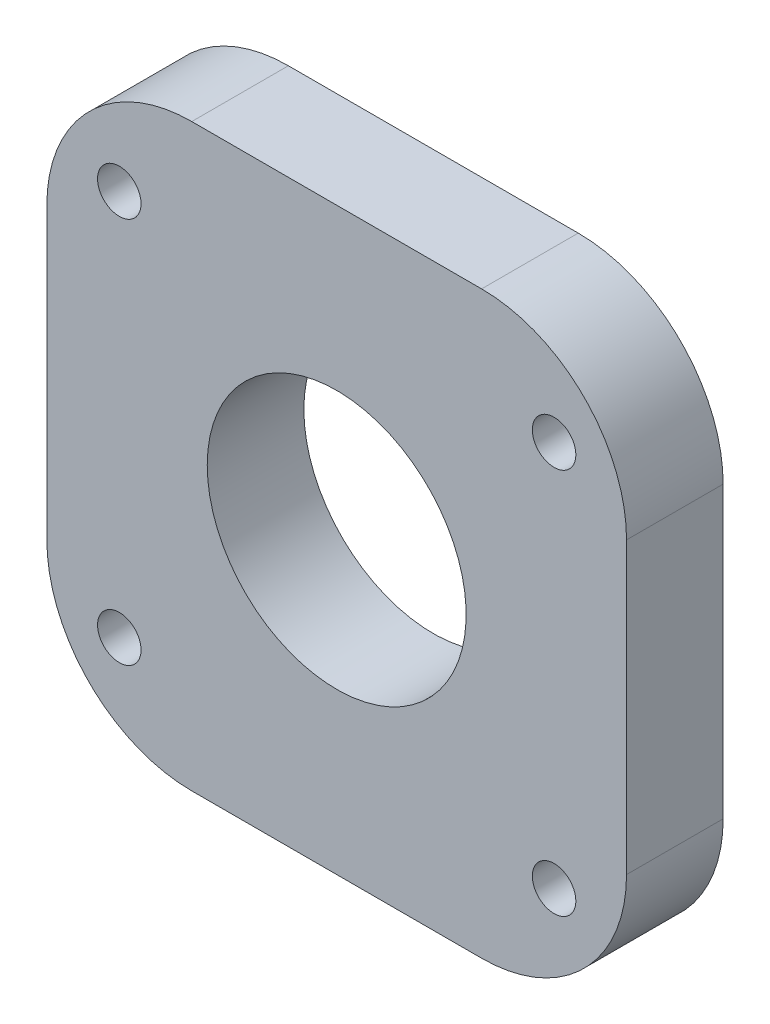
ISO-10303-21;
HEADER;
FILE_DESCRIPTION(('STEP AP214'),'2;1');
FILE_NAME('part.step','',(''),(''),'','','');
FILE_SCHEMA(('AUTOMOTIVE_DESIGN { 1 0 10303 214 1 1 1 1 }'));
ENDSEC;
DATA;
#1=APPLICATION_CONTEXT('core data for automotive mechanical design processes');
#2=APPLICATION_PROTOCOL_DEFINITION('international standard','automotive_design',2000,#1);
#3=PRODUCT_CONTEXT('',#1,'mechanical');
#4=PRODUCT('Part','Part','',(#3));
#5=PRODUCT_RELATED_PRODUCT_CATEGORY('part','',(#4));
#6=PRODUCT_DEFINITION_FORMATION('','',#4);
#7=PRODUCT_DEFINITION_CONTEXT('part definition',#1,'design');
#8=PRODUCT_DEFINITION('design','',#6,#7);
#9=PRODUCT_DEFINITION_SHAPE('','',#8);
#10=(LENGTH_UNIT() NAMED_UNIT(*) SI_UNIT(.MILLI.,.METRE.));
#11=(NAMED_UNIT(*) PLANE_ANGLE_UNIT() SI_UNIT($,.RADIAN.));
#12=(NAMED_UNIT(*) SI_UNIT($,.STERADIAN.) SOLID_ANGLE_UNIT());
#13=UNCERTAINTY_MEASURE_WITH_UNIT(LENGTH_MEASURE(1.E-05),#10,'distance_accuracy_value','');
#14=(GEOMETRIC_REPRESENTATION_CONTEXT(3) GLOBAL_UNCERTAINTY_ASSIGNED_CONTEXT((#13)) GLOBAL_UNIT_ASSIGNED_CONTEXT((#10,
#11,#12)) REPRESENTATION_CONTEXT('',''));
#15=CARTESIAN_POINT('',(0.,0.,0.));
#16=DIRECTION('',(0.,0.,1.));
#17=DIRECTION('',(1.,0.,0.));
#18=AXIS2_PLACEMENT_3D('',#15,#16,#17);
#19=CARTESIAN_POINT('',(30.,-30.,10.));
#20=DIRECTION('',(1.,0.,0.));
#21=DIRECTION('',(0.,0.,-1.));
#22=AXIS2_PLACEMENT_3D('',#19,#20,#21);
#23=PLANE('',#22);
#24=DIRECTION('',(0.,-1.,0.));
#25=VECTOR('',#24,1.);
#26=CARTESIAN_POINT('',(30.,-30.,10.));
#27=LINE('',#26,#25);
#28=CARTESIAN_POINT('',(30.,15.,10.));
#29=VERTEX_POINT('',#28);
#30=CARTESIAN_POINT('',(30.,-15.,10.));
#31=VERTEX_POINT('',#30);
#32=EDGE_CURVE('E258',#29,#31,#27,.T.);
#33=ORIENTED_EDGE('',*,*,#32,.T.);
#34=DIRECTION('',(0.,0.,-1.));
#35=VECTOR('',#34,1.);
#36=CARTESIAN_POINT('',(30.,-15.,10.));
#37=LINE('',#36,#35);
#38=CARTESIAN_POINT('',(30.,-15.,0.));
#39=VERTEX_POINT('',#38);
#40=EDGE_CURVE('E282',#31,#39,#37,.T.);
#41=ORIENTED_EDGE('',*,*,#40,.T.);
#42=DIRECTION('',(0.,-1.,0.));
#43=VECTOR('',#42,1.);
#44=CARTESIAN_POINT('',(30.,-30.,0.));
#45=LINE('',#44,#43);
#46=CARTESIAN_POINT('',(30.,15.,0.));
#47=VERTEX_POINT('',#46);
#48=EDGE_CURVE('E257',#47,#39,#45,.T.);
#49=ORIENTED_EDGE('',*,*,#48,.F.);
#50=DIRECTION('',(0.,0.,-1.));
#51=VECTOR('',#50,1.);
#52=CARTESIAN_POINT('',(30.,15.,10.));
#53=LINE('',#52,#51);
#54=EDGE_CURVE('E270',#47,#29,#53,.F.);
#55=ORIENTED_EDGE('',*,*,#54,.T.);
#56=EDGE_LOOP('',(#33,#41,#49,#55));
#57=FACE_BOUND('',#56,.T.);
#58=ADVANCED_FACE('F32',(#57),#23,.T.);
#59=CARTESIAN_POINT('',(-30.,30.,10.));
#60=DIRECTION('',(0.,1.,0.));
#61=DIRECTION('',(-1.,0.,0.));
#62=AXIS2_PLACEMENT_3D('',#59,#60,#61);
#63=PLANE('',#62);
#64=DIRECTION('',(1.,0.,0.));
#65=VECTOR('',#64,1.);
#66=CARTESIAN_POINT('',(-30.,30.,0.));
#67=LINE('',#66,#65);
#68=CARTESIAN_POINT('',(-15.,30.,0.));
#69=VERTEX_POINT('',#68);
#70=CARTESIAN_POINT('',(15.,30.,0.));
#71=VERTEX_POINT('',#70);
#72=EDGE_CURVE('E262',#69,#71,#67,.T.);
#73=ORIENTED_EDGE('',*,*,#72,.F.);
#74=DIRECTION('',(0.,0.,-1.));
#75=VECTOR('',#74,1.);
#76=CARTESIAN_POINT('',(-15.,30.,10.));
#77=LINE('',#76,#75);
#78=CARTESIAN_POINT('',(-15.,30.,10.));
#79=VERTEX_POINT('',#78);
#80=EDGE_CURVE('E11',#69,#79,#77,.F.);
#81=ORIENTED_EDGE('',*,*,#80,.T.);
#82=DIRECTION('',(1.,0.,0.));
#83=VECTOR('',#82,1.);
#84=CARTESIAN_POINT('',(-30.,30.,10.));
#85=LINE('',#84,#83);
#86=CARTESIAN_POINT('',(15.,30.,10.));
#87=VERTEX_POINT('',#86);
#88=EDGE_CURVE('E267',#79,#87,#85,.T.);
#89=ORIENTED_EDGE('',*,*,#88,.T.);
#90=DIRECTION('',(0.,0.,-1.));
#91=VECTOR('',#90,1.);
#92=CARTESIAN_POINT('',(15.,30.,10.));
#93=LINE('',#92,#91);
#94=EDGE_CURVE('E40',#87,#71,#93,.T.);
#95=ORIENTED_EDGE('',*,*,#94,.T.);
#96=EDGE_LOOP('',(#73,#81,#89,#95));
#97=FACE_BOUND('',#96,.T.);
#98=ADVANCED_FACE('F312',(#97),#63,.T.);
#99=CARTESIAN_POINT('',(-30.,-30.,10.));
#100=DIRECTION('',(-1.,0.,0.));
#101=DIRECTION('',(0.,0.,1.));
#102=AXIS2_PLACEMENT_3D('',#99,#100,#101);
#103=PLANE('',#102);
#104=DIRECTION('',(0.,1.,0.));
#105=VECTOR('',#104,1.);
#106=CARTESIAN_POINT('',(-30.,-30.,0.));
#107=LINE('',#106,#105);
#108=CARTESIAN_POINT('',(-30.,-15.,0.));
#109=VERTEX_POINT('',#108);
#110=CARTESIAN_POINT('',(-30.,15.,0.));
#111=VERTEX_POINT('',#110);
#112=EDGE_CURVE('E276',#109,#111,#107,.T.);
#113=ORIENTED_EDGE('',*,*,#112,.F.);
#114=DIRECTION('',(0.,0.,-1.));
#115=VECTOR('',#114,1.);
#116=CARTESIAN_POINT('',(-30.,-15.,10.));
#117=LINE('',#116,#115);
#118=CARTESIAN_POINT('',(-30.,-15.,10.));
#119=VERTEX_POINT('',#118);
#120=EDGE_CURVE('E54',#109,#119,#117,.F.);
#121=ORIENTED_EDGE('',*,*,#120,.T.);
#122=DIRECTION('',(0.,1.,0.));
#123=VECTOR('',#122,1.);
#124=CARTESIAN_POINT('',(-30.,-30.,10.));
#125=LINE('',#124,#123);
#126=CARTESIAN_POINT('',(-30.,15.,10.));
#127=VERTEX_POINT('',#126);
#128=EDGE_CURVE('E265',#119,#127,#125,.T.);
#129=ORIENTED_EDGE('',*,*,#128,.T.);
#130=DIRECTION('',(0.,0.,-1.));
#131=VECTOR('',#130,1.);
#132=CARTESIAN_POINT('',(-30.,15.,10.));
#133=LINE('',#132,#131);
#134=EDGE_CURVE('E305',#127,#111,#133,.T.);
#135=ORIENTED_EDGE('',*,*,#134,.T.);
#136=EDGE_LOOP('',(#113,#121,#129,#135));
#137=FACE_BOUND('',#136,.T.);
#138=ADVANCED_FACE('F322',(#137),#103,.T.);
#139=CARTESIAN_POINT('',(-30.,-30.,10.));
#140=DIRECTION('',(0.,-1.,0.));
#141=DIRECTION('',(1.,0.,0.));
#142=AXIS2_PLACEMENT_3D('',#139,#140,#141);
#143=PLANE('',#142);
#144=DIRECTION('',(-1.,0.,0.));
#145=VECTOR('',#144,1.);
#146=CARTESIAN_POINT('',(-30.,-30.,0.));
#147=LINE('',#146,#145);
#148=CARTESIAN_POINT('',(15.,-30.,0.));
#149=VERTEX_POINT('',#148);
#150=CARTESIAN_POINT('',(-15.,-30.,0.));
#151=VERTEX_POINT('',#150);
#152=EDGE_CURVE('E273',#149,#151,#147,.T.);
#153=ORIENTED_EDGE('',*,*,#152,.F.);
#154=DIRECTION('',(0.,0.,-1.));
#155=VECTOR('',#154,1.);
#156=CARTESIAN_POINT('',(15.,-30.,10.));
#157=LINE('',#156,#155);
#158=CARTESIAN_POINT('',(15.,-30.,10.));
#159=VERTEX_POINT('',#158);
#160=EDGE_CURVE('E296',#149,#159,#157,.F.);
#161=ORIENTED_EDGE('',*,*,#160,.T.);
#162=DIRECTION('',(-1.,0.,0.));
#163=VECTOR('',#162,1.);
#164=CARTESIAN_POINT('',(-30.,-30.,10.));
#165=LINE('',#164,#163);
#166=CARTESIAN_POINT('',(-15.,-30.,10.));
#167=VERTEX_POINT('',#166);
#168=EDGE_CURVE('E261',#159,#167,#165,.T.);
#169=ORIENTED_EDGE('',*,*,#168,.T.);
#170=DIRECTION('',(0.,0.,-1.));
#171=VECTOR('',#170,1.);
#172=CARTESIAN_POINT('',(-15.,-30.,10.));
#173=LINE('',#172,#171);
#174=EDGE_CURVE('E293',#167,#151,#173,.T.);
#175=ORIENTED_EDGE('',*,*,#174,.T.);
#176=EDGE_LOOP('',(#153,#161,#169,#175));
#177=FACE_BOUND('',#176,.T.);
#178=ADVANCED_FACE('F331',(#177),#143,.T.);
#179=CARTESIAN_POINT('',(0.,0.,10.));
#180=DIRECTION('',(0.,0.,-1.));
#181=DIRECTION('',(-1.,0.,0.));
#182=AXIS2_PLACEMENT_3D('',#179,#180,#181);
#183=PLANE('',#182);
#184=CARTESIAN_POINT('',(0.,0.,10.));
#185=DIRECTION('',(0.,0.,-1.));
#186=DIRECTION('',(-1.,0.,0.));
#187=AXIS2_PLACEMENT_3D('',#184,#185,#186);
#188=CIRCLE('',#187,13.4);
#189=CARTESIAN_POINT('',(-13.4,0.,10.));
#190=VERTEX_POINT('',#189);
#191=EDGE_CURVE('E155',#190,#190,#188,.T.);
#192=ORIENTED_EDGE('',*,*,#191,.T.);
#193=EDGE_LOOP('',(#192));
#194=FACE_BOUND('',#193,.T.);
#195=CARTESIAN_POINT('',(-22.5,20.,10.));
#196=DIRECTION('',(0.,0.,-1.));
#197=DIRECTION('',(-1.,0.,0.));
#198=AXIS2_PLACEMENT_3D('',#195,#196,#197);
#199=CIRCLE('',#198,2.25);
#200=CARTESIAN_POINT('',(-24.75,20.,10.));
#201=VERTEX_POINT('',#200);
#202=EDGE_CURVE('E236',#201,#201,#199,.T.);
#203=ORIENTED_EDGE('',*,*,#202,.T.);
#204=EDGE_LOOP('',(#203));
#205=FACE_BOUND('',#204,.T.);
#206=CARTESIAN_POINT('',(22.5,20.,10.));
#207=DIRECTION('',(0.,0.,-1.));
#208=DIRECTION('',(-1.,0.,0.));
#209=AXIS2_PLACEMENT_3D('',#206,#207,#208);
#210=CIRCLE('',#209,2.25);
#211=CARTESIAN_POINT('',(20.25,20.,10.));
#212=VERTEX_POINT('',#211);
#213=EDGE_CURVE('E242',#212,#212,#210,.T.);
#214=ORIENTED_EDGE('',*,*,#213,.T.);
#215=EDGE_LOOP('',(#214));
#216=FACE_BOUND('',#215,.T.);
#217=CARTESIAN_POINT('',(22.5,-20.,10.));
#218=DIRECTION('',(0.,0.,-1.));
#219=DIRECTION('',(-1.,0.,0.));
#220=AXIS2_PLACEMENT_3D('',#217,#218,#219);
#221=CIRCLE('',#220,2.25);
#222=CARTESIAN_POINT('',(20.25,-20.,10.));
#223=VERTEX_POINT('',#222);
#224=EDGE_CURVE('E248',#223,#223,#221,.T.);
#225=ORIENTED_EDGE('',*,*,#224,.T.);
#226=EDGE_LOOP('',(#225));
#227=FACE_BOUND('',#226,.T.);
#228=CARTESIAN_POINT('',(-22.5,-20.,10.));
#229=DIRECTION('',(0.,0.,-1.));
#230=DIRECTION('',(-1.,0.,0.));
#231=AXIS2_PLACEMENT_3D('',#228,#229,#230);
#232=CIRCLE('',#231,2.25);
#233=CARTESIAN_POINT('',(-24.75,-20.,10.));
#234=VERTEX_POINT('',#233);
#235=EDGE_CURVE('E254',#234,#234,#232,.T.);
#236=ORIENTED_EDGE('',*,*,#235,.T.);
#237=EDGE_LOOP('',(#236));
#238=FACE_BOUND('',#237,.T.);
#239=ORIENTED_EDGE('',*,*,#168,.F.);
#240=CARTESIAN_POINT('',(15.,-15.,10.));
#241=DIRECTION('',(0.,0.,-1.));
#242=DIRECTION('',(-1.,0.,0.));
#243=AXIS2_PLACEMENT_3D('',#240,#241,#242);
#244=CIRCLE('',#243,15.);
#245=EDGE_CURVE('E303',#159,#31,#244,.F.);
#246=ORIENTED_EDGE('',*,*,#245,.T.);
#247=ORIENTED_EDGE('',*,*,#32,.F.);
#248=CARTESIAN_POINT('',(15.,15.,10.));
#249=DIRECTION('',(0.,0.,-1.));
#250=DIRECTION('',(-1.,0.,0.));
#251=AXIS2_PLACEMENT_3D('',#248,#249,#250);
#252=CIRCLE('',#251,15.);
#253=EDGE_CURVE('E298',#29,#87,#252,.F.);
#254=ORIENTED_EDGE('',*,*,#253,.T.);
#255=ORIENTED_EDGE('',*,*,#88,.F.);
#256=CARTESIAN_POINT('',(-15.,15.,10.));
#257=DIRECTION('',(0.,0.,-1.));
#258=DIRECTION('',(-1.,0.,0.));
#259=AXIS2_PLACEMENT_3D('',#256,#257,#258);
#260=CIRCLE('',#259,15.);
#261=EDGE_CURVE('E47',#79,#127,#260,.F.);
#262=ORIENTED_EDGE('',*,*,#261,.T.);
#263=ORIENTED_EDGE('',*,*,#128,.F.);
#264=CARTESIAN_POINT('',(-15.,-15.,10.));
#265=DIRECTION('',(0.,0.,-1.));
#266=DIRECTION('',(-1.,0.,0.));
#267=AXIS2_PLACEMENT_3D('',#264,#265,#266);
#268=CIRCLE('',#267,15.);
#269=EDGE_CURVE('E301',#119,#167,#268,.F.);
#270=ORIENTED_EDGE('',*,*,#269,.T.);
#271=EDGE_LOOP('',(#239,#246,#247,#254,#255,#262,#263,#270));
#272=FACE_BOUND('',#271,.T.);
#273=ADVANCED_FACE('F325',(#194,#205,#216,#227,#238,#272),#183,.F.);
#274=CARTESIAN_POINT('',(0.,0.,0.));
#275=DIRECTION('',(0.,0.,-1.));
#276=DIRECTION('',(-1.,0.,0.));
#277=AXIS2_PLACEMENT_3D('',#274,#275,#276);
#278=PLANE('',#277);
#279=CARTESIAN_POINT('',(0.,0.,0.));
#280=DIRECTION('',(0.,0.,-1.));
#281=DIRECTION('',(-1.,0.,0.));
#282=AXIS2_PLACEMENT_3D('',#279,#280,#281);
#283=CIRCLE('',#282,13.4);
#284=CARTESIAN_POINT('',(-13.4,0.,0.));
#285=VERTEX_POINT('',#284);
#286=EDGE_CURVE('E765',#285,#285,#283,.T.);
#287=ORIENTED_EDGE('',*,*,#286,.F.);
#288=EDGE_LOOP('',(#287));
#289=FACE_BOUND('',#288,.T.);
#290=CARTESIAN_POINT('',(14.0338751103011,11.1916419433643,0.));
#291=DIRECTION('',(0.,0.,-1.));
#292=DIRECTION('',(-1.,0.,0.));
#293=AXIS2_PLACEMENT_3D('',#290,#291,#292);
#294=CIRCLE('',#293,2.54999999999999);
#295=CARTESIAN_POINT('',(11.4838751103011,11.1916419433643,0.));
#296=VERTEX_POINT('',#295);
#297=EDGE_CURVE('E149',#296,#296,#294,.T.);
#298=ORIENTED_EDGE('',*,*,#297,.F.);
#299=EDGE_LOOP('',(#298));
#300=FACE_BOUND('',#299,.T.);
#301=CARTESIAN_POINT('',(7.78821311716017,16.1723911788484,0.));
#302=DIRECTION('',(0.,0.,-1.));
#303=DIRECTION('',(-1.,0.,0.));
#304=AXIS2_PLACEMENT_3D('',#301,#302,#303);
#305=CIRCLE('',#304,2.54999999999999);
#306=CARTESIAN_POINT('',(5.23821311716018,16.1723911788484,0.));
#307=VERTEX_POINT('',#306);
#308=EDGE_CURVE('E148',#307,#307,#305,.T.);
#309=ORIENTED_EDGE('',*,*,#308,.F.);
#310=EDGE_LOOP('',(#309));
#311=FACE_BOUND('',#310,.T.);
#312=CARTESIAN_POINT('',(0.,17.95,0.));
#313=DIRECTION('',(0.,0.,-1.));
#314=DIRECTION('',(-1.,0.,0.));
#315=AXIS2_PLACEMENT_3D('',#312,#313,#314);
#316=CIRCLE('',#315,2.54999999999999);
#317=CARTESIAN_POINT('',(-2.54999999999999,17.95,0.));
#318=VERTEX_POINT('',#317);
#319=EDGE_CURVE('E161',#318,#318,#316,.T.);
#320=ORIENTED_EDGE('',*,*,#319,.F.);
#321=EDGE_LOOP('',(#320));
#322=FACE_BOUND('',#321,.T.);
#323=CARTESIAN_POINT('',(-7.78821311716017,16.1723911788484,0.));
#324=DIRECTION('',(0.,0.,-1.));
#325=DIRECTION('',(-1.,0.,0.));
#326=AXIS2_PLACEMENT_3D('',#323,#324,#325);
#327=CIRCLE('',#326,2.54999999999999);
#328=CARTESIAN_POINT('',(-10.3382131171602,16.1723911788484,0.));
#329=VERTEX_POINT('',#328);
#330=EDGE_CURVE('E167',#329,#329,#327,.T.);
#331=ORIENTED_EDGE('',*,*,#330,.F.);
#332=EDGE_LOOP('',(#331));
#333=FACE_BOUND('',#332,.T.);
#334=CARTESIAN_POINT('',(-14.0338751103011,11.1916419433643,0.));
#335=DIRECTION('',(0.,0.,-1.));
#336=DIRECTION('',(-1.,0.,0.));
#337=AXIS2_PLACEMENT_3D('',#334,#335,#336);
#338=CIRCLE('',#337,2.54999999999999);
#339=CARTESIAN_POINT('',(-16.5838751103011,11.1916419433643,0.));
#340=VERTEX_POINT('',#339);
#341=EDGE_CURVE('E173',#340,#340,#338,.T.);
#342=ORIENTED_EDGE('',*,*,#341,.F.);
#343=EDGE_LOOP('',(#342));
#344=FACE_BOUND('',#343,.T.);
#345=CARTESIAN_POINT('',(-17.4999560236637,3.99425076451585,0.));
#346=DIRECTION('',(0.,0.,-1.));
#347=DIRECTION('',(-1.,0.,0.));
#348=AXIS2_PLACEMENT_3D('',#345,#346,#347);
#349=CIRCLE('',#348,2.54999999999999);
#350=CARTESIAN_POINT('',(-20.0499560236637,3.99425076451585,0.));
#351=VERTEX_POINT('',#350);
#352=EDGE_CURVE('E179',#351,#351,#349,.T.);
#353=ORIENTED_EDGE('',*,*,#352,.F.);
#354=EDGE_LOOP('',(#353));
#355=FACE_BOUND('',#354,.T.);
#356=CARTESIAN_POINT('',(-17.4999560236637,-3.99425076451584,0.));
#357=DIRECTION('',(0.,0.,-1.));
#358=DIRECTION('',(-1.,0.,0.));
#359=AXIS2_PLACEMENT_3D('',#356,#357,#358);
#360=CIRCLE('',#359,2.54999999999999);
#361=CARTESIAN_POINT('',(-20.0499560236637,-3.99425076451584,0.));
#362=VERTEX_POINT('',#361);
#363=EDGE_CURVE('E185',#362,#362,#360,.T.);
#364=ORIENTED_EDGE('',*,*,#363,.F.);
#365=EDGE_LOOP('',(#364));
#366=FACE_BOUND('',#365,.T.);
#367=CARTESIAN_POINT('',(-14.0338751103011,-11.1916419433643,0.));
#368=DIRECTION('',(0.,0.,-1.));
#369=DIRECTION('',(-1.,0.,0.));
#370=AXIS2_PLACEMENT_3D('',#367,#368,#369);
#371=CIRCLE('',#370,2.54999999999999);
#372=CARTESIAN_POINT('',(-16.5838751103011,-11.1916419433643,0.));
#373=VERTEX_POINT('',#372);
#374=EDGE_CURVE('E191',#373,#373,#371,.T.);
#375=ORIENTED_EDGE('',*,*,#374,.F.);
#376=EDGE_LOOP('',(#375));
#377=FACE_BOUND('',#376,.T.);
#378=CARTESIAN_POINT('',(-7.78821311716017,-16.1723911788484,0.));
#379=DIRECTION('',(0.,0.,-1.));
#380=DIRECTION('',(-1.,0.,0.));
#381=AXIS2_PLACEMENT_3D('',#378,#379,#380);
#382=CIRCLE('',#381,2.54999999999999);
#383=CARTESIAN_POINT('',(-10.3382131171602,-16.1723911788484,0.));
#384=VERTEX_POINT('',#383);
#385=EDGE_CURVE('E197',#384,#384,#382,.T.);
#386=ORIENTED_EDGE('',*,*,#385,.F.);
#387=EDGE_LOOP('',(#386));
#388=FACE_BOUND('',#387,.T.);
#389=CARTESIAN_POINT('',(0.,-17.95,0.));
#390=DIRECTION('',(0.,0.,-1.));
#391=DIRECTION('',(-1.,0.,0.));
#392=AXIS2_PLACEMENT_3D('',#389,#390,#391);
#393=CIRCLE('',#392,2.54999999999999);
#394=CARTESIAN_POINT('',(-2.54999999999999,-17.95,0.));
#395=VERTEX_POINT('',#394);
#396=EDGE_CURVE('E203',#395,#395,#393,.T.);
#397=ORIENTED_EDGE('',*,*,#396,.F.);
#398=EDGE_LOOP('',(#397));
#399=FACE_BOUND('',#398,.T.);
#400=CARTESIAN_POINT('',(7.78821311716017,-16.1723911788484,0.));
#401=DIRECTION('',(0.,0.,-1.));
#402=DIRECTION('',(-1.,0.,0.));
#403=AXIS2_PLACEMENT_3D('',#400,#401,#402);
#404=CIRCLE('',#403,2.54999999999999);
#405=CARTESIAN_POINT('',(5.23821311716018,-16.1723911788484,0.));
#406=VERTEX_POINT('',#405);
#407=EDGE_CURVE('E209',#406,#406,#404,.T.);
#408=ORIENTED_EDGE('',*,*,#407,.F.);
#409=EDGE_LOOP('',(#408));
#410=FACE_BOUND('',#409,.T.);
#411=CARTESIAN_POINT('',(14.0338751103011,-11.1916419433643,0.));
#412=DIRECTION('',(0.,0.,-1.));
#413=DIRECTION('',(-1.,0.,0.));
#414=AXIS2_PLACEMENT_3D('',#411,#412,#413);
#415=CIRCLE('',#414,2.54999999999999);
#416=CARTESIAN_POINT('',(11.4838751103011,-11.1916419433643,0.));
#417=VERTEX_POINT('',#416);
#418=EDGE_CURVE('E215',#417,#417,#415,.T.);
#419=ORIENTED_EDGE('',*,*,#418,.F.);
#420=EDGE_LOOP('',(#419));
#421=FACE_BOUND('',#420,.T.);
#422=CARTESIAN_POINT('',(17.4999560236637,-3.99425076451584,0.));
#423=DIRECTION('',(0.,0.,-1.));
#424=DIRECTION('',(-1.,0.,0.));
#425=AXIS2_PLACEMENT_3D('',#422,#423,#424);
#426=CIRCLE('',#425,2.54999999999999);
#427=CARTESIAN_POINT('',(14.9499560236637,-3.99425076451584,0.));
#428=VERTEX_POINT('',#427);
#429=EDGE_CURVE('E221',#428,#428,#426,.T.);
#430=ORIENTED_EDGE('',*,*,#429,.F.);
#431=EDGE_LOOP('',(#430));
#432=FACE_BOUND('',#431,.T.);
#433=CARTESIAN_POINT('',(17.4999560236637,3.99425076451585,0.));
#434=DIRECTION('',(0.,0.,-1.));
#435=DIRECTION('',(-1.,0.,0.));
#436=AXIS2_PLACEMENT_3D('',#433,#434,#435);
#437=CIRCLE('',#436,2.54999999999999);
#438=CARTESIAN_POINT('',(14.9499560236637,3.99425076451585,0.));
#439=VERTEX_POINT('',#438);
#440=EDGE_CURVE('E227',#439,#439,#437,.T.);
#441=ORIENTED_EDGE('',*,*,#440,.F.);
#442=EDGE_LOOP('',(#441));
#443=FACE_BOUND('',#442,.T.);
#444=CARTESIAN_POINT('',(-22.5,20.,0.));
#445=DIRECTION('',(0.,0.,-1.));
#446=DIRECTION('',(-1.,0.,0.));
#447=AXIS2_PLACEMENT_3D('',#444,#445,#446);
#448=CIRCLE('',#447,2.24999999999999);
#449=CARTESIAN_POINT('',(-24.75,20.,0.));
#450=VERTEX_POINT('',#449);
#451=EDGE_CURVE('E233',#450,#450,#448,.T.);
#452=ORIENTED_EDGE('',*,*,#451,.F.);
#453=EDGE_LOOP('',(#452));
#454=FACE_BOUND('',#453,.T.);
#455=CARTESIAN_POINT('',(22.5,20.,0.));
#456=DIRECTION('',(0.,0.,-1.));
#457=DIRECTION('',(-1.,0.,0.));
#458=AXIS2_PLACEMENT_3D('',#455,#456,#457);
#459=CIRCLE('',#458,2.24999999999999);
#460=CARTESIAN_POINT('',(20.25,20.,0.));
#461=VERTEX_POINT('',#460);
#462=EDGE_CURVE('E239',#461,#461,#459,.T.);
#463=ORIENTED_EDGE('',*,*,#462,.F.);
#464=EDGE_LOOP('',(#463));
#465=FACE_BOUND('',#464,.T.);
#466=CARTESIAN_POINT('',(22.5,-20.,0.));
#467=DIRECTION('',(0.,0.,-1.));
#468=DIRECTION('',(-1.,0.,0.));
#469=AXIS2_PLACEMENT_3D('',#466,#467,#468);
#470=CIRCLE('',#469,2.24999999999999);
#471=CARTESIAN_POINT('',(20.25,-20.,0.));
#472=VERTEX_POINT('',#471);
#473=EDGE_CURVE('E245',#472,#472,#470,.T.);
#474=ORIENTED_EDGE('',*,*,#473,.F.);
#475=EDGE_LOOP('',(#474));
#476=FACE_BOUND('',#475,.T.);
#477=CARTESIAN_POINT('',(-22.5,-20.,0.));
#478=DIRECTION('',(0.,0.,-1.));
#479=DIRECTION('',(-1.,0.,0.));
#480=AXIS2_PLACEMENT_3D('',#477,#478,#479);
#481=CIRCLE('',#480,2.24999999999999);
#482=CARTESIAN_POINT('',(-24.75,-20.,0.));
#483=VERTEX_POINT('',#482);
#484=EDGE_CURVE('E251',#483,#483,#481,.T.);
#485=ORIENTED_EDGE('',*,*,#484,.F.);
#486=EDGE_LOOP('',(#485));
#487=FACE_BOUND('',#486,.T.);
#488=ORIENTED_EDGE('',*,*,#48,.T.);
#489=CARTESIAN_POINT('',(15.,-15.,0.));
#490=DIRECTION('',(0.,0.,-1.));
#491=DIRECTION('',(-1.,0.,0.));
#492=AXIS2_PLACEMENT_3D('',#489,#490,#491);
#493=CIRCLE('',#492,15.);
#494=EDGE_CURVE('E291',#39,#149,#493,.T.);
#495=ORIENTED_EDGE('',*,*,#494,.T.);
#496=ORIENTED_EDGE('',*,*,#152,.T.);
#497=CARTESIAN_POINT('',(-15.,-15.,0.));
#498=DIRECTION('',(0.,0.,-1.));
#499=DIRECTION('',(-1.,0.,0.));
#500=AXIS2_PLACEMENT_3D('',#497,#498,#499);
#501=CIRCLE('',#500,15.);
#502=EDGE_CURVE('E289',#151,#109,#501,.T.);
#503=ORIENTED_EDGE('',*,*,#502,.T.);
#504=ORIENTED_EDGE('',*,*,#112,.T.);
#505=CARTESIAN_POINT('',(-15.,15.,0.));
#506=DIRECTION('',(0.,0.,-1.));
#507=DIRECTION('',(-1.,0.,0.));
#508=AXIS2_PLACEMENT_3D('',#505,#506,#507);
#509=CIRCLE('',#508,15.);
#510=EDGE_CURVE('E287',#111,#69,#509,.T.);
#511=ORIENTED_EDGE('',*,*,#510,.T.);
#512=ORIENTED_EDGE('',*,*,#72,.T.);
#513=CARTESIAN_POINT('',(15.,15.,0.));
#514=DIRECTION('',(0.,0.,-1.));
#515=DIRECTION('',(-1.,0.,0.));
#516=AXIS2_PLACEMENT_3D('',#513,#514,#515);
#517=CIRCLE('',#516,15.);
#518=EDGE_CURVE('E285',#71,#47,#517,.T.);
#519=ORIENTED_EDGE('',*,*,#518,.T.);
#520=EDGE_LOOP('',(#488,#495,#496,#503,#504,#511,#512,#519));
#521=FACE_BOUND('',#520,.T.);
#522=ADVANCED_FACE('F317',(#289,#300,#311,#322,#333,#344,#355,#366,#377,#388,#399,#410,#421,
#432,#443,#454,#465,#476,#487,#521),#278,.T.);
#523=CARTESIAN_POINT('',(-22.5,-20.,0.));
#524=DIRECTION('',(0.,0.,-1.));
#525=DIRECTION('',(-1.,0.,0.));
#526=AXIS2_PLACEMENT_3D('',#523,#524,#525);
#527=CYLINDRICAL_SURFACE('',#526,2.24999999999999);
#528=ORIENTED_EDGE('',*,*,#235,.F.);
#529=EDGE_LOOP('',(#528));
#530=FACE_BOUND('',#529,.T.);
#531=ORIENTED_EDGE('',*,*,#484,.T.);
#532=EDGE_LOOP('',(#531));
#533=FACE_BOUND('',#532,.T.);
#534=ADVANCED_FACE('F658',(#530,#533),#527,.F.);
#535=CARTESIAN_POINT('',(22.5,-20.,0.));
#536=DIRECTION('',(0.,0.,-1.));
#537=DIRECTION('',(-1.,0.,0.));
#538=AXIS2_PLACEMENT_3D('',#535,#536,#537);
#539=CYLINDRICAL_SURFACE('',#538,2.24999999999999);
#540=ORIENTED_EDGE('',*,*,#224,.F.);
#541=EDGE_LOOP('',(#540));
#542=FACE_BOUND('',#541,.T.);
#543=ORIENTED_EDGE('',*,*,#473,.T.);
#544=EDGE_LOOP('',(#543));
#545=FACE_BOUND('',#544,.T.);
#546=ADVANCED_FACE('F649',(#542,#545),#539,.F.);
#547=CARTESIAN_POINT('',(22.5,20.,0.));
#548=DIRECTION('',(0.,0.,-1.));
#549=DIRECTION('',(-1.,0.,0.));
#550=AXIS2_PLACEMENT_3D('',#547,#548,#549);
#551=CYLINDRICAL_SURFACE('',#550,2.24999999999999);
#552=ORIENTED_EDGE('',*,*,#213,.F.);
#553=EDGE_LOOP('',(#552));
#554=FACE_BOUND('',#553,.T.);
#555=ORIENTED_EDGE('',*,*,#462,.T.);
#556=EDGE_LOOP('',(#555));
#557=FACE_BOUND('',#556,.T.);
#558=ADVANCED_FACE('F640',(#554,#557),#551,.F.);
#559=CARTESIAN_POINT('',(-22.5,20.,0.));
#560=DIRECTION('',(0.,0.,-1.));
#561=DIRECTION('',(-1.,0.,0.));
#562=AXIS2_PLACEMENT_3D('',#559,#560,#561);
#563=CYLINDRICAL_SURFACE('',#562,2.24999999999999);
#564=ORIENTED_EDGE('',*,*,#202,.F.);
#565=EDGE_LOOP('',(#564));
#566=FACE_BOUND('',#565,.T.);
#567=ORIENTED_EDGE('',*,*,#451,.T.);
#568=EDGE_LOOP('',(#567));
#569=FACE_BOUND('',#568,.T.);
#570=ADVANCED_FACE('F631',(#566,#569),#563,.F.);
#571=CARTESIAN_POINT('',(17.4999560236637,3.99425076451585,7.));
#572=DIRECTION('',(0.,0.,-1.));
#573=DIRECTION('',(-1.,0.,0.));
#574=AXIS2_PLACEMENT_3D('',#571,#572,#573);
#575=CONICAL_SURFACE('',#574,2.55,1.02974425867665);
#576=CARTESIAN_POINT('',(17.4999560236637,3.99425076451585,8.53219457852028));
#577=VERTEX_POINT('',#576);
#578=VERTEX_LOOP('',#577);
#579=FACE_BOUND('',#578,.T.);
#580=CARTESIAN_POINT('',(17.4999560236637,3.99425076451585,7.));
#581=DIRECTION('',(0.,0.,-1.));
#582=DIRECTION('',(-1.,0.,0.));
#583=AXIS2_PLACEMENT_3D('',#580,#581,#582);
#584=CIRCLE('',#583,2.55);
#585=CARTESIAN_POINT('',(14.9499560236637,3.99425076451585,7.));
#586=VERTEX_POINT('',#585);
#587=EDGE_CURVE('E230',#586,#586,#584,.T.);
#588=ORIENTED_EDGE('',*,*,#587,.T.);
#589=EDGE_LOOP('',(#588));
#590=FACE_BOUND('',#589,.T.);
#591=ADVANCED_FACE('F622',(#579,#590),#575,.F.);
#592=CARTESIAN_POINT('',(17.4999560236637,3.99425076451585,0.));
#593=DIRECTION('',(0.,0.,-1.));
#594=DIRECTION('',(-1.,0.,0.));
#595=AXIS2_PLACEMENT_3D('',#592,#593,#594);
#596=CYLINDRICAL_SURFACE('',#595,2.54999999999999);
#597=ORIENTED_EDGE('',*,*,#587,.F.);
#598=EDGE_LOOP('',(#597));
#599=FACE_BOUND('',#598,.T.);
#600=ORIENTED_EDGE('',*,*,#440,.T.);
#601=EDGE_LOOP('',(#600));
#602=FACE_BOUND('',#601,.T.);
#603=ADVANCED_FACE('F613',(#599,#602),#596,.F.);
#604=CARTESIAN_POINT('',(17.4999560236637,-3.99425076451584,7.));
#605=DIRECTION('',(0.,0.,-1.));
#606=DIRECTION('',(-1.,0.,0.));
#607=AXIS2_PLACEMENT_3D('',#604,#605,#606);
#608=CONICAL_SURFACE('',#607,2.55,1.02974425867665);
#609=CARTESIAN_POINT('',(17.4999560236637,-3.99425076451584,8.53219457852028));
#610=VERTEX_POINT('',#609);
#611=VERTEX_LOOP('',#610);
#612=FACE_BOUND('',#611,.T.);
#613=CARTESIAN_POINT('',(17.4999560236637,-3.99425076451584,7.));
#614=DIRECTION('',(0.,0.,-1.));
#615=DIRECTION('',(-1.,0.,0.));
#616=AXIS2_PLACEMENT_3D('',#613,#614,#615);
#617=CIRCLE('',#616,2.55);
#618=CARTESIAN_POINT('',(14.9499560236637,-3.99425076451584,7.));
#619=VERTEX_POINT('',#618);
#620=EDGE_CURVE('E224',#619,#619,#617,.T.);
#621=ORIENTED_EDGE('',*,*,#620,.T.);
#622=EDGE_LOOP('',(#621));
#623=FACE_BOUND('',#622,.T.);
#624=ADVANCED_FACE('F604',(#612,#623),#608,.F.);
#625=CARTESIAN_POINT('',(17.4999560236637,-3.99425076451584,0.));
#626=DIRECTION('',(0.,0.,-1.));
#627=DIRECTION('',(-1.,0.,0.));
#628=AXIS2_PLACEMENT_3D('',#625,#626,#627);
#629=CYLINDRICAL_SURFACE('',#628,2.54999999999999);
#630=ORIENTED_EDGE('',*,*,#620,.F.);
#631=EDGE_LOOP('',(#630));
#632=FACE_BOUND('',#631,.T.);
#633=ORIENTED_EDGE('',*,*,#429,.T.);
#634=EDGE_LOOP('',(#633));
#635=FACE_BOUND('',#634,.T.);
#636=ADVANCED_FACE('F595',(#632,#635),#629,.F.);
#637=CARTESIAN_POINT('',(14.0338751103011,-11.1916419433643,7.));
#638=DIRECTION('',(0.,0.,-1.));
#639=DIRECTION('',(-1.,0.,0.));
#640=AXIS2_PLACEMENT_3D('',#637,#638,#639);
#641=CONICAL_SURFACE('',#640,2.55,1.02974425867665);
#642=CARTESIAN_POINT('',(14.0338751103011,-11.1916419433643,8.53219457852028));
#643=VERTEX_POINT('',#642);
#644=VERTEX_LOOP('',#643);
#645=FACE_BOUND('',#644,.T.);
#646=CARTESIAN_POINT('',(14.0338751103011,-11.1916419433643,7.));
#647=DIRECTION('',(0.,0.,-1.));
#648=DIRECTION('',(-1.,0.,0.));
#649=AXIS2_PLACEMENT_3D('',#646,#647,#648);
#650=CIRCLE('',#649,2.55);
#651=CARTESIAN_POINT('',(11.4838751103011,-11.1916419433643,7.));
#652=VERTEX_POINT('',#651);
#653=EDGE_CURVE('E218',#652,#652,#650,.T.);
#654=ORIENTED_EDGE('',*,*,#653,.T.);
#655=EDGE_LOOP('',(#654));
#656=FACE_BOUND('',#655,.T.);
#657=ADVANCED_FACE('F586',(#645,#656),#641,.F.);
#658=CARTESIAN_POINT('',(14.0338751103011,-11.1916419433643,0.));
#659=DIRECTION('',(0.,0.,-1.));
#660=DIRECTION('',(-1.,0.,0.));
#661=AXIS2_PLACEMENT_3D('',#658,#659,#660);
#662=CYLINDRICAL_SURFACE('',#661,2.54999999999999);
#663=ORIENTED_EDGE('',*,*,#653,.F.);
#664=EDGE_LOOP('',(#663));
#665=FACE_BOUND('',#664,.T.);
#666=ORIENTED_EDGE('',*,*,#418,.T.);
#667=EDGE_LOOP('',(#666));
#668=FACE_BOUND('',#667,.T.);
#669=ADVANCED_FACE('F577',(#665,#668),#662,.F.);
#670=CARTESIAN_POINT('',(7.78821311716017,-16.1723911788484,7.));
#671=DIRECTION('',(0.,0.,-1.));
#672=DIRECTION('',(-1.,0.,0.));
#673=AXIS2_PLACEMENT_3D('',#670,#671,#672);
#674=CONICAL_SURFACE('',#673,2.55,1.02974425867665);
#675=CARTESIAN_POINT('',(7.78821311716016,-16.1723911788484,8.53219457852028));
#676=VERTEX_POINT('',#675);
#677=VERTEX_LOOP('',#676);
#678=FACE_BOUND('',#677,.T.);
#679=CARTESIAN_POINT('',(7.78821311716017,-16.1723911788484,7.));
#680=DIRECTION('',(0.,0.,-1.));
#681=DIRECTION('',(-1.,0.,0.));
#682=AXIS2_PLACEMENT_3D('',#679,#680,#681);
#683=CIRCLE('',#682,2.55);
#684=CARTESIAN_POINT('',(5.23821311716017,-16.1723911788484,7.));
#685=VERTEX_POINT('',#684);
#686=EDGE_CURVE('E212',#685,#685,#683,.T.);
#687=ORIENTED_EDGE('',*,*,#686,.T.);
#688=EDGE_LOOP('',(#687));
#689=FACE_BOUND('',#688,.T.);
#690=ADVANCED_FACE('F568',(#678,#689),#674,.F.);
#691=CARTESIAN_POINT('',(7.78821311716017,-16.1723911788484,0.));
#692=DIRECTION('',(0.,0.,-1.));
#693=DIRECTION('',(-1.,0.,0.));
#694=AXIS2_PLACEMENT_3D('',#691,#692,#693);
#695=CYLINDRICAL_SURFACE('',#694,2.54999999999999);
#696=ORIENTED_EDGE('',*,*,#686,.F.);
#697=EDGE_LOOP('',(#696));
#698=FACE_BOUND('',#697,.T.);
#699=ORIENTED_EDGE('',*,*,#407,.T.);
#700=EDGE_LOOP('',(#699));
#701=FACE_BOUND('',#700,.T.);
#702=ADVANCED_FACE('F559',(#698,#701),#695,.F.);
#703=CARTESIAN_POINT('',(0.,-17.95,7.));
#704=DIRECTION('',(0.,0.,-1.));
#705=DIRECTION('',(-1.,0.,0.));
#706=AXIS2_PLACEMENT_3D('',#703,#704,#705);
#707=CONICAL_SURFACE('',#706,2.55,1.02974425867665);
#708=CARTESIAN_POINT('',(0.,-17.95,8.53219457852028));
#709=VERTEX_POINT('',#708);
#710=VERTEX_LOOP('',#709);
#711=FACE_BOUND('',#710,.T.);
#712=CARTESIAN_POINT('',(0.,-17.95,7.));
#713=DIRECTION('',(0.,0.,-1.));
#714=DIRECTION('',(-1.,0.,0.));
#715=AXIS2_PLACEMENT_3D('',#712,#713,#714);
#716=CIRCLE('',#715,2.55);
#717=CARTESIAN_POINT('',(-2.55,-17.95,7.));
#718=VERTEX_POINT('',#717);
#719=EDGE_CURVE('E206',#718,#718,#716,.T.);
#720=ORIENTED_EDGE('',*,*,#719,.T.);
#721=EDGE_LOOP('',(#720));
#722=FACE_BOUND('',#721,.T.);
#723=ADVANCED_FACE('F550',(#711,#722),#707,.F.);
#724=CARTESIAN_POINT('',(0.,-17.95,0.));
#725=DIRECTION('',(0.,0.,-1.));
#726=DIRECTION('',(-1.,0.,0.));
#727=AXIS2_PLACEMENT_3D('',#724,#725,#726);
#728=CYLINDRICAL_SURFACE('',#727,2.54999999999999);
#729=ORIENTED_EDGE('',*,*,#719,.F.);
#730=EDGE_LOOP('',(#729));
#731=FACE_BOUND('',#730,.T.);
#732=ORIENTED_EDGE('',*,*,#396,.T.);
#733=EDGE_LOOP('',(#732));
#734=FACE_BOUND('',#733,.T.);
#735=ADVANCED_FACE('F541',(#731,#734),#728,.F.);
#736=CARTESIAN_POINT('',(-7.78821311716017,-16.1723911788484,7.));
#737=DIRECTION('',(0.,0.,-1.));
#738=DIRECTION('',(-1.,0.,0.));
#739=AXIS2_PLACEMENT_3D('',#736,#737,#738);
#740=CONICAL_SURFACE('',#739,2.55,1.02974425867665);
#741=CARTESIAN_POINT('',(-7.78821311716017,-16.1723911788484,8.53219457852028));
#742=VERTEX_POINT('',#741);
#743=VERTEX_LOOP('',#742);
#744=FACE_BOUND('',#743,.T.);
#745=CARTESIAN_POINT('',(-7.78821311716017,-16.1723911788484,7.));
#746=DIRECTION('',(0.,0.,-1.));
#747=DIRECTION('',(-1.,0.,0.));
#748=AXIS2_PLACEMENT_3D('',#745,#746,#747);
#749=CIRCLE('',#748,2.55);
#750=CARTESIAN_POINT('',(-10.3382131171602,-16.1723911788484,7.));
#751=VERTEX_POINT('',#750);
#752=EDGE_CURVE('E200',#751,#751,#749,.T.);
#753=ORIENTED_EDGE('',*,*,#752,.T.);
#754=EDGE_LOOP('',(#753));
#755=FACE_BOUND('',#754,.T.);
#756=ADVANCED_FACE('F532',(#744,#755),#740,.F.);
#757=CARTESIAN_POINT('',(-7.78821311716017,-16.1723911788484,0.));
#758=DIRECTION('',(0.,0.,-1.));
#759=DIRECTION('',(-1.,0.,0.));
#760=AXIS2_PLACEMENT_3D('',#757,#758,#759);
#761=CYLINDRICAL_SURFACE('',#760,2.54999999999999);
#762=ORIENTED_EDGE('',*,*,#752,.F.);
#763=EDGE_LOOP('',(#762));
#764=FACE_BOUND('',#763,.T.);
#765=ORIENTED_EDGE('',*,*,#385,.T.);
#766=EDGE_LOOP('',(#765));
#767=FACE_BOUND('',#766,.T.);
#768=ADVANCED_FACE('F523',(#764,#767),#761,.F.);
#769=CARTESIAN_POINT('',(-14.0338751103011,-11.1916419433643,7.));
#770=DIRECTION('',(0.,0.,-1.));
#771=DIRECTION('',(-1.,0.,0.));
#772=AXIS2_PLACEMENT_3D('',#769,#770,#771);
#773=CONICAL_SURFACE('',#772,2.55,1.02974425867665);
#774=CARTESIAN_POINT('',(-14.0338751103011,-11.1916419433643,8.53219457852028));
#775=VERTEX_POINT('',#774);
#776=VERTEX_LOOP('',#775);
#777=FACE_BOUND('',#776,.T.);
#778=CARTESIAN_POINT('',(-14.0338751103011,-11.1916419433643,7.));
#779=DIRECTION('',(0.,0.,-1.));
#780=DIRECTION('',(-1.,0.,0.));
#781=AXIS2_PLACEMENT_3D('',#778,#779,#780);
#782=CIRCLE('',#781,2.55);
#783=CARTESIAN_POINT('',(-16.5838751103011,-11.1916419433643,7.));
#784=VERTEX_POINT('',#783);
#785=EDGE_CURVE('E194',#784,#784,#782,.T.);
#786=ORIENTED_EDGE('',*,*,#785,.T.);
#787=EDGE_LOOP('',(#786));
#788=FACE_BOUND('',#787,.T.);
#789=ADVANCED_FACE('F514',(#777,#788),#773,.F.);
#790=CARTESIAN_POINT('',(-14.0338751103011,-11.1916419433643,0.));
#791=DIRECTION('',(0.,0.,-1.));
#792=DIRECTION('',(-1.,0.,0.));
#793=AXIS2_PLACEMENT_3D('',#790,#791,#792);
#794=CYLINDRICAL_SURFACE('',#793,2.54999999999999);
#795=ORIENTED_EDGE('',*,*,#785,.F.);
#796=EDGE_LOOP('',(#795));
#797=FACE_BOUND('',#796,.T.);
#798=ORIENTED_EDGE('',*,*,#374,.T.);
#799=EDGE_LOOP('',(#798));
#800=FACE_BOUND('',#799,.T.);
#801=ADVANCED_FACE('F505',(#797,#800),#794,.F.);
#802=CARTESIAN_POINT('',(-17.4999560236637,-3.99425076451584,7.));
#803=DIRECTION('',(0.,0.,-1.));
#804=DIRECTION('',(-1.,0.,0.));
#805=AXIS2_PLACEMENT_3D('',#802,#803,#804);
#806=CONICAL_SURFACE('',#805,2.55,1.02974425867665);
#807=CARTESIAN_POINT('',(-17.4999560236637,-3.99425076451584,8.53219457852028));
#808=VERTEX_POINT('',#807);
#809=VERTEX_LOOP('',#808);
#810=FACE_BOUND('',#809,.T.);
#811=CARTESIAN_POINT('',(-17.4999560236637,-3.99425076451584,7.));
#812=DIRECTION('',(0.,0.,-1.));
#813=DIRECTION('',(-1.,0.,0.));
#814=AXIS2_PLACEMENT_3D('',#811,#812,#813);
#815=CIRCLE('',#814,2.55);
#816=CARTESIAN_POINT('',(-20.0499560236637,-3.99425076451584,7.));
#817=VERTEX_POINT('',#816);
#818=EDGE_CURVE('E188',#817,#817,#815,.T.);
#819=ORIENTED_EDGE('',*,*,#818,.T.);
#820=EDGE_LOOP('',(#819));
#821=FACE_BOUND('',#820,.T.);
#822=ADVANCED_FACE('F496',(#810,#821),#806,.F.);
#823=CARTESIAN_POINT('',(-17.4999560236637,-3.99425076451584,0.));
#824=DIRECTION('',(0.,0.,-1.));
#825=DIRECTION('',(-1.,0.,0.));
#826=AXIS2_PLACEMENT_3D('',#823,#824,#825);
#827=CYLINDRICAL_SURFACE('',#826,2.54999999999999);
#828=ORIENTED_EDGE('',*,*,#818,.F.);
#829=EDGE_LOOP('',(#828));
#830=FACE_BOUND('',#829,.T.);
#831=ORIENTED_EDGE('',*,*,#363,.T.);
#832=EDGE_LOOP('',(#831));
#833=FACE_BOUND('',#832,.T.);
#834=ADVANCED_FACE('F487',(#830,#833),#827,.F.);
#835=CARTESIAN_POINT('',(-17.4999560236637,3.99425076451585,7.));
#836=DIRECTION('',(0.,0.,-1.));
#837=DIRECTION('',(-1.,0.,0.));
#838=AXIS2_PLACEMENT_3D('',#835,#836,#837);
#839=CONICAL_SURFACE('',#838,2.55,1.02974425867665);
#840=CARTESIAN_POINT('',(-17.4999560236637,3.99425076451585,8.53219457852028));
#841=VERTEX_POINT('',#840);
#842=VERTEX_LOOP('',#841);
#843=FACE_BOUND('',#842,.T.);
#844=CARTESIAN_POINT('',(-17.4999560236637,3.99425076451585,7.));
#845=DIRECTION('',(0.,0.,-1.));
#846=DIRECTION('',(-1.,0.,0.));
#847=AXIS2_PLACEMENT_3D('',#844,#845,#846);
#848=CIRCLE('',#847,2.55);
#849=CARTESIAN_POINT('',(-20.0499560236637,3.99425076451585,7.));
#850=VERTEX_POINT('',#849);
#851=EDGE_CURVE('E182',#850,#850,#848,.T.);
#852=ORIENTED_EDGE('',*,*,#851,.T.);
#853=EDGE_LOOP('',(#852));
#854=FACE_BOUND('',#853,.T.);
#855=ADVANCED_FACE('F478',(#843,#854),#839,.F.);
#856=CARTESIAN_POINT('',(-17.4999560236637,3.99425076451585,0.));
#857=DIRECTION('',(0.,0.,-1.));
#858=DIRECTION('',(-1.,0.,0.));
#859=AXIS2_PLACEMENT_3D('',#856,#857,#858);
#860=CYLINDRICAL_SURFACE('',#859,2.54999999999999);
#861=ORIENTED_EDGE('',*,*,#851,.F.);
#862=EDGE_LOOP('',(#861));
#863=FACE_BOUND('',#862,.T.);
#864=ORIENTED_EDGE('',*,*,#352,.T.);
#865=EDGE_LOOP('',(#864));
#866=FACE_BOUND('',#865,.T.);
#867=ADVANCED_FACE('F469',(#863,#866),#860,.F.);
#868=CARTESIAN_POINT('',(-14.0338751103011,11.1916419433643,7.));
#869=DIRECTION('',(0.,0.,-1.));
#870=DIRECTION('',(-1.,0.,0.));
#871=AXIS2_PLACEMENT_3D('',#868,#869,#870);
#872=CONICAL_SURFACE('',#871,2.55,1.02974425867665);
#873=CARTESIAN_POINT('',(-14.0338751103011,11.1916419433643,8.53219457852028));
#874=VERTEX_POINT('',#873);
#875=VERTEX_LOOP('',#874);
#876=FACE_BOUND('',#875,.T.);
#877=CARTESIAN_POINT('',(-14.0338751103011,11.1916419433643,7.));
#878=DIRECTION('',(0.,0.,-1.));
#879=DIRECTION('',(-1.,0.,0.));
#880=AXIS2_PLACEMENT_3D('',#877,#878,#879);
#881=CIRCLE('',#880,2.55);
#882=CARTESIAN_POINT('',(-16.5838751103011,11.1916419433643,7.));
#883=VERTEX_POINT('',#882);
#884=EDGE_CURVE('E176',#883,#883,#881,.T.);
#885=ORIENTED_EDGE('',*,*,#884,.T.);
#886=EDGE_LOOP('',(#885));
#887=FACE_BOUND('',#886,.T.);
#888=ADVANCED_FACE('F460',(#876,#887),#872,.F.);
#889=CARTESIAN_POINT('',(-14.0338751103011,11.1916419433643,0.));
#890=DIRECTION('',(0.,0.,-1.));
#891=DIRECTION('',(-1.,0.,0.));
#892=AXIS2_PLACEMENT_3D('',#889,#890,#891);
#893=CYLINDRICAL_SURFACE('',#892,2.54999999999999);
#894=ORIENTED_EDGE('',*,*,#884,.F.);
#895=EDGE_LOOP('',(#894));
#896=FACE_BOUND('',#895,.T.);
#897=ORIENTED_EDGE('',*,*,#341,.T.);
#898=EDGE_LOOP('',(#897));
#899=FACE_BOUND('',#898,.T.);
#900=ADVANCED_FACE('F451',(#896,#899),#893,.F.);
#901=CARTESIAN_POINT('',(-7.78821311716017,16.1723911788484,7.));
#902=DIRECTION('',(0.,0.,-1.));
#903=DIRECTION('',(-1.,0.,0.));
#904=AXIS2_PLACEMENT_3D('',#901,#902,#903);
#905=CONICAL_SURFACE('',#904,2.55,1.02974425867665);
#906=CARTESIAN_POINT('',(-7.78821311716017,16.1723911788484,8.53219457852028));
#907=VERTEX_POINT('',#906);
#908=VERTEX_LOOP('',#907);
#909=FACE_BOUND('',#908,.T.);
#910=CARTESIAN_POINT('',(-7.78821311716017,16.1723911788484,7.));
#911=DIRECTION('',(0.,0.,-1.));
#912=DIRECTION('',(-1.,0.,0.));
#913=AXIS2_PLACEMENT_3D('',#910,#911,#912);
#914=CIRCLE('',#913,2.55);
#915=CARTESIAN_POINT('',(-10.3382131171602,16.1723911788484,7.));
#916=VERTEX_POINT('',#915);
#917=EDGE_CURVE('E170',#916,#916,#914,.T.);
#918=ORIENTED_EDGE('',*,*,#917,.T.);
#919=EDGE_LOOP('',(#918));
#920=FACE_BOUND('',#919,.T.);
#921=ADVANCED_FACE('F442',(#909,#920),#905,.F.);
#922=CARTESIAN_POINT('',(-7.78821311716017,16.1723911788484,0.));
#923=DIRECTION('',(0.,0.,-1.));
#924=DIRECTION('',(-1.,0.,0.));
#925=AXIS2_PLACEMENT_3D('',#922,#923,#924);
#926=CYLINDRICAL_SURFACE('',#925,2.54999999999999);
#927=ORIENTED_EDGE('',*,*,#917,.F.);
#928=EDGE_LOOP('',(#927));
#929=FACE_BOUND('',#928,.T.);
#930=ORIENTED_EDGE('',*,*,#330,.T.);
#931=EDGE_LOOP('',(#930));
#932=FACE_BOUND('',#931,.T.);
#933=ADVANCED_FACE('F433',(#929,#932),#926,.F.);
#934=CARTESIAN_POINT('',(0.,17.95,7.));
#935=DIRECTION('',(0.,0.,-1.));
#936=DIRECTION('',(-1.,0.,0.));
#937=AXIS2_PLACEMENT_3D('',#934,#935,#936);
#938=CONICAL_SURFACE('',#937,2.55,1.02974425867665);
#939=CARTESIAN_POINT('',(0.,17.95,8.53219457852028));
#940=VERTEX_POINT('',#939);
#941=VERTEX_LOOP('',#940);
#942=FACE_BOUND('',#941,.T.);
#943=CARTESIAN_POINT('',(0.,17.95,7.));
#944=DIRECTION('',(0.,0.,-1.));
#945=DIRECTION('',(-1.,0.,0.));
#946=AXIS2_PLACEMENT_3D('',#943,#944,#945);
#947=CIRCLE('',#946,2.55);
#948=CARTESIAN_POINT('',(-2.55,17.95,7.));
#949=VERTEX_POINT('',#948);
#950=EDGE_CURVE('E164',#949,#949,#947,.T.);
#951=ORIENTED_EDGE('',*,*,#950,.T.);
#952=EDGE_LOOP('',(#951));
#953=FACE_BOUND('',#952,.T.);
#954=ADVANCED_FACE('F424',(#942,#953),#938,.F.);
#955=CARTESIAN_POINT('',(0.,17.95,0.));
#956=DIRECTION('',(0.,0.,-1.));
#957=DIRECTION('',(-1.,0.,0.));
#958=AXIS2_PLACEMENT_3D('',#955,#956,#957);
#959=CYLINDRICAL_SURFACE('',#958,2.54999999999999);
#960=ORIENTED_EDGE('',*,*,#950,.F.);
#961=EDGE_LOOP('',(#960));
#962=FACE_BOUND('',#961,.T.);
#963=ORIENTED_EDGE('',*,*,#319,.T.);
#964=EDGE_LOOP('',(#963));
#965=FACE_BOUND('',#964,.T.);
#966=ADVANCED_FACE('F415',(#962,#965),#959,.F.);
#967=CARTESIAN_POINT('',(7.78821311716017,16.1723911788484,7.));
#968=DIRECTION('',(0.,0.,-1.));
#969=DIRECTION('',(-1.,0.,0.));
#970=AXIS2_PLACEMENT_3D('',#967,#968,#969);
#971=CONICAL_SURFACE('',#970,2.55,1.02974425867665);
#972=CARTESIAN_POINT('',(7.78821311716017,16.1723911788484,8.53219457852028));
#973=VERTEX_POINT('',#972);
#974=VERTEX_LOOP('',#973);
#975=FACE_BOUND('',#974,.T.);
#976=CARTESIAN_POINT('',(7.78821311716017,16.1723911788484,7.));
#977=DIRECTION('',(0.,0.,-1.));
#978=DIRECTION('',(-1.,0.,0.));
#979=AXIS2_PLACEMENT_3D('',#976,#977,#978);
#980=CIRCLE('',#979,2.55);
#981=CARTESIAN_POINT('',(5.23821311716017,16.1723911788484,7.));
#982=VERTEX_POINT('',#981);
#983=EDGE_CURVE('E152',#982,#982,#980,.T.);
#984=ORIENTED_EDGE('',*,*,#983,.T.);
#985=EDGE_LOOP('',(#984));
#986=FACE_BOUND('',#985,.T.);
#987=ADVANCED_FACE('F406',(#975,#986),#971,.F.);
#988=CARTESIAN_POINT('',(7.78821311716017,16.1723911788484,0.));
#989=DIRECTION('',(0.,0.,-1.));
#990=DIRECTION('',(-1.,0.,0.));
#991=AXIS2_PLACEMENT_3D('',#988,#989,#990);
#992=CYLINDRICAL_SURFACE('',#991,2.54999999999999);
#993=ORIENTED_EDGE('',*,*,#983,.F.);
#994=EDGE_LOOP('',(#993));
#995=FACE_BOUND('',#994,.T.);
#996=ORIENTED_EDGE('',*,*,#308,.T.);
#997=EDGE_LOOP('',(#996));
#998=FACE_BOUND('',#997,.T.);
#999=ADVANCED_FACE('F142',(#995,#998),#992,.F.);
#1000=CARTESIAN_POINT('',(14.0338751103011,11.1916419433643,7.));
#1001=DIRECTION('',(0.,0.,-1.));
#1002=DIRECTION('',(-1.,0.,0.));
#1003=AXIS2_PLACEMENT_3D('',#1000,#1001,#1002);
#1004=CONICAL_SURFACE('',#1003,2.55,1.02974425867665);
#1005=CARTESIAN_POINT('',(14.0338751103011,11.1916419433643,8.53219457852028));
#1006=VERTEX_POINT('',#1005);
#1007=VERTEX_LOOP('',#1006);
#1008=FACE_BOUND('',#1007,.T.);
#1009=CARTESIAN_POINT('',(14.0338751103011,11.1916419433643,7.));
#1010=DIRECTION('',(0.,0.,-1.));
#1011=DIRECTION('',(-1.,0.,0.));
#1012=AXIS2_PLACEMENT_3D('',#1009,#1010,#1011);
#1013=CIRCLE('',#1012,2.55);
#1014=CARTESIAN_POINT('',(11.4838751103011,11.1916419433643,7.));
#1015=VERTEX_POINT('',#1014);
#1016=EDGE_CURVE('E146',#1015,#1015,#1013,.T.);
#1017=ORIENTED_EDGE('',*,*,#1016,.T.);
#1018=EDGE_LOOP('',(#1017));
#1019=FACE_BOUND('',#1018,.T.);
#1020=ADVANCED_FACE('F138',(#1008,#1019),#1004,.F.);
#1021=CARTESIAN_POINT('',(14.0338751103011,11.1916419433643,0.));
#1022=DIRECTION('',(0.,0.,-1.));
#1023=DIRECTION('',(-1.,0.,0.));
#1024=AXIS2_PLACEMENT_3D('',#1021,#1022,#1023);
#1025=CYLINDRICAL_SURFACE('',#1024,2.54999999999999);
#1026=ORIENTED_EDGE('',*,*,#1016,.F.);
#1027=EDGE_LOOP('',(#1026));
#1028=FACE_BOUND('',#1027,.T.);
#1029=ORIENTED_EDGE('',*,*,#297,.T.);
#1030=EDGE_LOOP('',(#1029));
#1031=FACE_BOUND('',#1030,.T.);
#1032=ADVANCED_FACE('F141',(#1028,#1031),#1025,.F.);
#1033=CARTESIAN_POINT('',(0.,0.,10.));
#1034=DIRECTION('',(0.,0.,-1.));
#1035=DIRECTION('',(-1.,0.,0.));
#1036=AXIS2_PLACEMENT_3D('',#1033,#1034,#1035);
#1037=CYLINDRICAL_SURFACE('',#1036,13.4);
#1038=ORIENTED_EDGE('',*,*,#191,.F.);
#1039=EDGE_LOOP('',(#1038));
#1040=FACE_BOUND('',#1039,.T.);
#1041=ORIENTED_EDGE('',*,*,#286,.T.);
#1042=EDGE_LOOP('',(#1041));
#1043=FACE_BOUND('',#1042,.T.);
#1044=ADVANCED_FACE('F355',(#1040,#1043),#1037,.F.);
#1045=CARTESIAN_POINT('',(15.,-15.,10.));
#1046=DIRECTION('',(0.,0.,-1.));
#1047=DIRECTION('',(-1.,0.,0.));
#1048=AXIS2_PLACEMENT_3D('',#1045,#1046,#1047);
#1049=CYLINDRICAL_SURFACE('',#1048,15.);
#1050=ORIENTED_EDGE('',*,*,#245,.F.);
#1051=ORIENTED_EDGE('',*,*,#160,.F.);
#1052=ORIENTED_EDGE('',*,*,#494,.F.);
#1053=ORIENTED_EDGE('',*,*,#40,.F.);
#1054=EDGE_LOOP('',(#1050,#1051,#1052,#1053));
#1055=FACE_BOUND('',#1054,.T.);
#1056=ADVANCED_FACE('F336',(#1055),#1049,.T.);
#1057=CARTESIAN_POINT('',(-15.,-15.,10.));
#1058=DIRECTION('',(0.,0.,-1.));
#1059=DIRECTION('',(-1.,0.,0.));
#1060=AXIS2_PLACEMENT_3D('',#1057,#1058,#1059);
#1061=CYLINDRICAL_SURFACE('',#1060,15.);
#1062=ORIENTED_EDGE('',*,*,#269,.F.);
#1063=ORIENTED_EDGE('',*,*,#120,.F.);
#1064=ORIENTED_EDGE('',*,*,#502,.F.);
#1065=ORIENTED_EDGE('',*,*,#174,.F.);
#1066=EDGE_LOOP('',(#1062,#1063,#1064,#1065));
#1067=FACE_BOUND('',#1066,.T.);
#1068=ADVANCED_FACE('F328',(#1067),#1061,.T.);
#1069=CARTESIAN_POINT('',(-15.,15.,10.));
#1070=DIRECTION('',(0.,0.,-1.));
#1071=DIRECTION('',(-1.,0.,0.));
#1072=AXIS2_PLACEMENT_3D('',#1069,#1070,#1071);
#1073=CYLINDRICAL_SURFACE('',#1072,15.);
#1074=ORIENTED_EDGE('',*,*,#261,.F.);
#1075=ORIENTED_EDGE('',*,*,#80,.F.);
#1076=ORIENTED_EDGE('',*,*,#510,.F.);
#1077=ORIENTED_EDGE('',*,*,#134,.F.);
#1078=EDGE_LOOP('',(#1074,#1075,#1076,#1077));
#1079=FACE_BOUND('',#1078,.T.);
#1080=ADVANCED_FACE('F321',(#1079),#1073,.T.);
#1081=CARTESIAN_POINT('',(15.,15.,10.));
#1082=DIRECTION('',(0.,0.,-1.));
#1083=DIRECTION('',(-1.,0.,0.));
#1084=AXIS2_PLACEMENT_3D('',#1081,#1082,#1083);
#1085=CYLINDRICAL_SURFACE('',#1084,15.);
#1086=ORIENTED_EDGE('',*,*,#253,.F.);
#1087=ORIENTED_EDGE('',*,*,#54,.F.);
#1088=ORIENTED_EDGE('',*,*,#518,.F.);
#1089=ORIENTED_EDGE('',*,*,#94,.F.);
#1090=EDGE_LOOP('',(#1086,#1087,#1088,#1089));
#1091=FACE_BOUND('',#1090,.T.);
#1092=ADVANCED_FACE('F34',(#1091),#1085,.T.);
#1093=CLOSED_SHELL('',(#58,#98,#138,#178,#273,#522,#534,#546,#558,#570,#591,#603,#624,#636,#657,
#669,#690,#702,#723,#735,#756,#768,#789,#801,#822,#834,#855,#867,#888,#900,#921,#933,#954,#966,
#987,#999,#1020,#1032,#1044,#1056,#1068,#1080,#1092));
#1094=MANIFOLD_SOLID_BREP('B2',#1093);
#1095=ADVANCED_BREP_SHAPE_REPRESENTATION('',(#18,#1094),#14);
#1096=SHAPE_DEFINITION_REPRESENTATION(#9,#1095);
ENDSEC;
END-ISO-10303-21;
